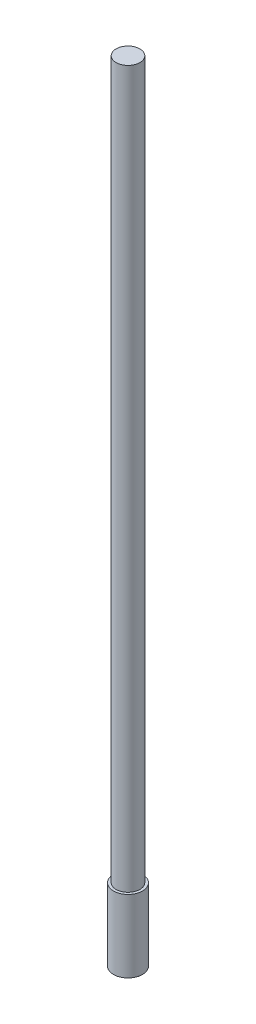
ISO-10303-21;
HEADER;
FILE_DESCRIPTION(('STEP AP214'),'2;1');
FILE_NAME('part.step','',(''),(''),'','','');
FILE_SCHEMA(('AUTOMOTIVE_DESIGN { 1 0 10303 214 1 1 1 1 }'));
ENDSEC;
DATA;
#1=APPLICATION_CONTEXT('core data for automotive mechanical design processes');
#2=APPLICATION_PROTOCOL_DEFINITION('international standard','automotive_design',2000,#1);
#3=PRODUCT_CONTEXT('',#1,'mechanical');
#4=PRODUCT('Part','Part','',(#3));
#5=PRODUCT_RELATED_PRODUCT_CATEGORY('part','',(#4));
#6=PRODUCT_DEFINITION_FORMATION('','',#4);
#7=PRODUCT_DEFINITION_CONTEXT('part definition',#1,'design');
#8=PRODUCT_DEFINITION('design','',#6,#7);
#9=PRODUCT_DEFINITION_SHAPE('','',#8);
#10=(LENGTH_UNIT() NAMED_UNIT(*) SI_UNIT(.MILLI.,.METRE.));
#11=(NAMED_UNIT(*) PLANE_ANGLE_UNIT() SI_UNIT($,.RADIAN.));
#12=(NAMED_UNIT(*) SI_UNIT($,.STERADIAN.) SOLID_ANGLE_UNIT());
#13=UNCERTAINTY_MEASURE_WITH_UNIT(LENGTH_MEASURE(1.E-05),#10,'distance_accuracy_value','');
#14=(GEOMETRIC_REPRESENTATION_CONTEXT(3) GLOBAL_UNCERTAINTY_ASSIGNED_CONTEXT((#13)) GLOBAL_UNIT_ASSIGNED_CONTEXT((#10,
#11,#12)) REPRESENTATION_CONTEXT('',''));
#15=CARTESIAN_POINT('',(0.,0.,0.));
#16=DIRECTION('',(0.,0.,1.));
#17=DIRECTION('',(1.,0.,0.));
#18=AXIS2_PLACEMENT_3D('',#15,#16,#17);
#19=CARTESIAN_POINT('',(2.89945402584125,-71.3823034840326,4.76463741933245));
#20=DIRECTION('',(0.,1.,0.));
#21=DIRECTION('',(0.,0.,1.));
#22=AXIS2_PLACEMENT_3D('',#19,#20,#21);
#23=CYLINDRICAL_SURFACE('',#22,1.4);
#24=CARTESIAN_POINT('',(2.89945402584125,-69.6323034840326,4.76463741933245));
#25=DIRECTION('',(0.,-1.,0.));
#26=DIRECTION('',(0.,0.,-1.));
#27=AXIS2_PLACEMENT_3D('',#24,#25,#26);
#28=CIRCLE('',#27,1.4);
#29=CARTESIAN_POINT('',(2.89945402584125,-69.6323034840326,3.36463741933245));
#30=VERTEX_POINT('',#29);
#31=EDGE_CURVE('E10',#30,#30,#28,.T.);
#32=ORIENTED_EDGE('',*,*,#31,.F.);
#33=EDGE_LOOP('',(#32));
#34=FACE_BOUND('',#33,.T.);
#35=CARTESIAN_POINT('',(2.89945402584125,-62.6323034840326,4.76463741933245));
#36=DIRECTION('',(0.,1.,0.));
#37=DIRECTION('',(0.,0.,1.));
#38=AXIS2_PLACEMENT_3D('',#35,#36,#37);
#39=CIRCLE('',#38,1.4);
#40=CARTESIAN_POINT('',(2.89945402584125,-62.6323034840326,6.16463741933245));
#41=VERTEX_POINT('',#40);
#42=EDGE_CURVE('E50',#41,#41,#39,.T.);
#43=ORIENTED_EDGE('',*,*,#42,.F.);
#44=EDGE_LOOP('',(#43));
#45=FACE_BOUND('',#44,.T.);
#46=ADVANCED_FACE('F36',(#34,#45),#23,.T.);
#47=CARTESIAN_POINT('',(2.89945402584125,-69.6323034840326,4.76463741933245));
#48=DIRECTION('',(0.,-1.,0.));
#49=DIRECTION('',(0.,0.,-1.));
#50=AXIS2_PLACEMENT_3D('',#47,#48,#49);
#51=PLANE('',#50);
#52=ORIENTED_EDGE('',*,*,#31,.T.);
#53=EDGE_LOOP('',(#52));
#54=FACE_BOUND('',#53,.T.);
#55=ADVANCED_FACE('F68',(#54),#51,.T.);
#56=CARTESIAN_POINT('',(2.89945402584125,46.6176965159674,4.76463741933245));
#57=DIRECTION('',(0.,-1.,0.));
#58=DIRECTION('',(0.,0.,-1.));
#59=AXIS2_PLACEMENT_3D('',#56,#57,#58);
#60=CYLINDRICAL_SURFACE('',#59,1.15);
#61=CARTESIAN_POINT('',(2.89945402584125,6.61769651596735,4.76463741933245));
#62=DIRECTION('',(0.,1.,0.));
#63=DIRECTION('',(0.,0.,1.));
#64=AXIS2_PLACEMENT_3D('',#61,#62,#63);
#65=CIRCLE('',#64,1.15);
#66=CARTESIAN_POINT('',(2.89945402584125,6.61769651596735,5.91463741933245));
#67=VERTEX_POINT('',#66);
#68=EDGE_CURVE('E40',#67,#67,#65,.F.);
#69=ORIENTED_EDGE('',*,*,#68,.T.);
#70=EDGE_LOOP('',(#69));
#71=FACE_BOUND('',#70,.T.);
#72=CARTESIAN_POINT('',(2.89945402584125,-62.6323034840326,4.76463741933245));
#73=DIRECTION('',(0.,1.,0.));
#74=DIRECTION('',(0.,0.,1.));
#75=AXIS2_PLACEMENT_3D('',#72,#73,#74);
#76=CIRCLE('',#75,1.15);
#77=CARTESIAN_POINT('',(2.89945402584125,-62.6323034840326,5.91463741933245));
#78=VERTEX_POINT('',#77);
#79=EDGE_CURVE('E55',#78,#78,#76,.T.);
#80=ORIENTED_EDGE('',*,*,#79,.T.);
#81=EDGE_LOOP('',(#80));
#82=FACE_BOUND('',#81,.T.);
#83=ADVANCED_FACE('F59',(#71,#82),#60,.T.);
#84=CARTESIAN_POINT('',(2.89945402584125,-62.6323034840326,4.76463741933245));
#85=DIRECTION('',(0.,1.,0.));
#86=DIRECTION('',(0.,0.,1.));
#87=AXIS2_PLACEMENT_3D('',#84,#85,#86);
#88=PLANE('',#87);
#89=ORIENTED_EDGE('',*,*,#79,.F.);
#90=EDGE_LOOP('',(#89));
#91=FACE_BOUND('',#90,.T.);
#92=ORIENTED_EDGE('',*,*,#42,.T.);
#93=EDGE_LOOP('',(#92));
#94=FACE_BOUND('',#93,.T.);
#95=ADVANCED_FACE('F61',(#91,#94),#88,.T.);
#96=CARTESIAN_POINT('',(2.89945402584125,6.61769651596735,4.76463741933245));
#97=DIRECTION('',(0.,1.,0.));
#98=DIRECTION('',(0.,0.,1.));
#99=AXIS2_PLACEMENT_3D('',#96,#97,#98);
#100=PLANE('',#99);
#101=ORIENTED_EDGE('',*,*,#68,.F.);
#102=EDGE_LOOP('',(#101));
#103=FACE_BOUND('',#102,.T.);
#104=ADVANCED_FACE('F38',(#103),#100,.T.);
#105=CLOSED_SHELL('',(#46,#55,#83,#95,#104));
#106=MANIFOLD_SOLID_BREP('B2',#105);
#107=ADVANCED_BREP_SHAPE_REPRESENTATION('',(#18,#106),#14);
#108=SHAPE_DEFINITION_REPRESENTATION(#9,#107);
ENDSEC;
END-ISO-10303-21;
